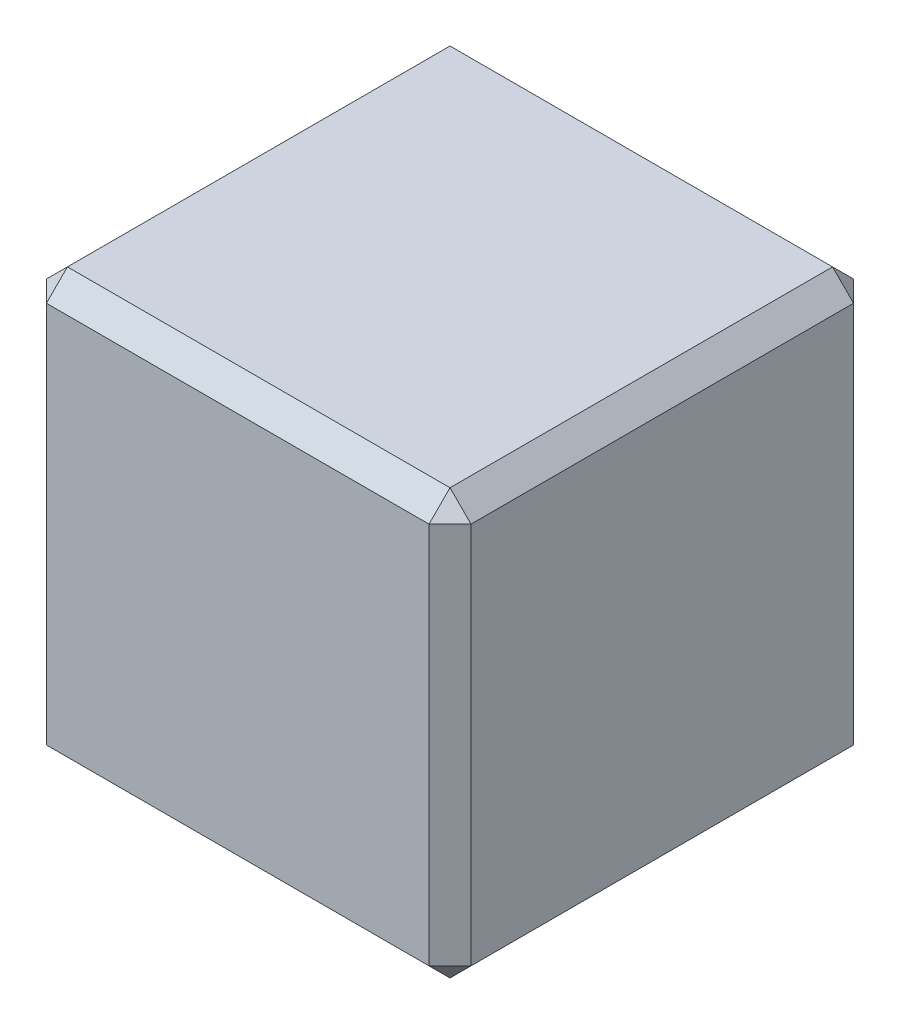
ISO-10303-21;
HEADER;
FILE_DESCRIPTION(('STEP AP214'),'2;1');
FILE_NAME('part.step','',(''),(''),'','','');
FILE_SCHEMA(('AUTOMOTIVE_DESIGN { 1 0 10303 214 1 1 1 1 }'));
ENDSEC;
DATA;
#1=APPLICATION_CONTEXT('core data for automotive mechanical design processes');
#2=APPLICATION_PROTOCOL_DEFINITION('international standard','automotive_design',2000,#1);
#3=PRODUCT_CONTEXT('',#1,'mechanical');
#4=PRODUCT('Part','Part','',(#3));
#5=PRODUCT_RELATED_PRODUCT_CATEGORY('part','',(#4));
#6=PRODUCT_DEFINITION_FORMATION('','',#4);
#7=PRODUCT_DEFINITION_CONTEXT('part definition',#1,'design');
#8=PRODUCT_DEFINITION('design','',#6,#7);
#9=PRODUCT_DEFINITION_SHAPE('','',#8);
#10=(LENGTH_UNIT() NAMED_UNIT(*) SI_UNIT(.MILLI.,.METRE.));
#11=(NAMED_UNIT(*) PLANE_ANGLE_UNIT() SI_UNIT($,.RADIAN.));
#12=(NAMED_UNIT(*) SI_UNIT($,.STERADIAN.) SOLID_ANGLE_UNIT());
#13=UNCERTAINTY_MEASURE_WITH_UNIT(LENGTH_MEASURE(1.E-05),#10,'distance_accuracy_value','');
#14=(GEOMETRIC_REPRESENTATION_CONTEXT(3) GLOBAL_UNCERTAINTY_ASSIGNED_CONTEXT((#13)) GLOBAL_UNIT_ASSIGNED_CONTEXT((#10,
#11,#12)) REPRESENTATION_CONTEXT('',''));
#15=CARTESIAN_POINT('',(0.,0.,0.));
#16=DIRECTION('',(0.,0.,1.));
#17=DIRECTION('',(1.,0.,0.));
#18=AXIS2_PLACEMENT_3D('',#15,#16,#17);
#19=CARTESIAN_POINT('',(50.54,101.08,-50.54));
#20=DIRECTION('',(-1.,0.,0.));
#21=DIRECTION('',(0.,0.,1.));
#22=AXIS2_PLACEMENT_3D('',#19,#20,#21);
#23=PLANE('',#22);
#24=DIRECTION('',(0.,0.,-1.));
#25=VECTOR('',#24,1.);
#26=CARTESIAN_POINT('',(50.54,5.00000000000005,-50.54));
#27=LINE('',#26,#25);
#28=CARTESIAN_POINT('',(50.54,5.00000000000005,45.54));
#29=VERTEX_POINT('',#28);
#30=CARTESIAN_POINT('',(50.54,5.00000000000005,-45.54));
#31=VERTEX_POINT('',#30);
#32=EDGE_CURVE('E286',#29,#31,#27,.T.);
#33=ORIENTED_EDGE('',*,*,#32,.T.);
#34=DIRECTION('',(0.,1.,0.));
#35=VECTOR('',#34,1.);
#36=CARTESIAN_POINT('',(50.54,101.08,-45.54));
#37=LINE('',#36,#35);
#38=CARTESIAN_POINT('',(50.54,96.08,-45.54));
#39=VERTEX_POINT('',#38);
#40=EDGE_CURVE('E218',#31,#39,#37,.T.);
#41=ORIENTED_EDGE('',*,*,#40,.T.);
#42=DIRECTION('',(0.,0.,1.));
#43=VECTOR('',#42,1.);
#44=CARTESIAN_POINT('',(50.54,96.08,50.54));
#45=LINE('',#44,#43);
#46=CARTESIAN_POINT('',(50.54,96.08,45.54));
#47=VERTEX_POINT('',#46);
#48=EDGE_CURVE('E279',#39,#47,#45,.T.);
#49=ORIENTED_EDGE('',*,*,#48,.T.);
#50=DIRECTION('',(0.,-1.,0.));
#51=VECTOR('',#50,1.);
#52=CARTESIAN_POINT('',(50.54,101.08,45.54));
#53=LINE('',#52,#51);
#54=EDGE_CURVE('E281',#47,#29,#53,.T.);
#55=ORIENTED_EDGE('',*,*,#54,.T.);
#56=EDGE_LOOP('',(#33,#41,#49,#55));
#57=FACE_BOUND('',#56,.T.);
#58=ADVANCED_FACE('F39',(#57),#23,.F.);
#59=CARTESIAN_POINT('',(-50.54,101.08,-50.54));
#60=DIRECTION('',(0.,0.,1.));
#61=DIRECTION('',(1.,0.,0.));
#62=AXIS2_PLACEMENT_3D('',#59,#60,#61);
#63=PLANE('',#62);
#64=DIRECTION('',(0.,-1.,0.));
#65=VECTOR('',#64,1.);
#66=CARTESIAN_POINT('',(45.54,101.08,-50.54));
#67=LINE('',#66,#65);
#68=CARTESIAN_POINT('',(45.54,96.08,-50.54));
#69=VERTEX_POINT('',#68);
#70=CARTESIAN_POINT('',(45.54,5.00000000000002,-50.54));
#71=VERTEX_POINT('',#70);
#72=EDGE_CURVE('E137',#69,#71,#67,.T.);
#73=ORIENTED_EDGE('',*,*,#72,.T.);
#74=DIRECTION('',(-1.,0.,0.));
#75=VECTOR('',#74,1.);
#76=CARTESIAN_POINT('',(-50.54,5.00000000000002,-50.54));
#77=LINE('',#76,#75);
#78=CARTESIAN_POINT('',(-45.54,5.00000000000002,-50.54));
#79=VERTEX_POINT('',#78);
#80=EDGE_CURVE('E133',#71,#79,#77,.T.);
#81=ORIENTED_EDGE('',*,*,#80,.T.);
#82=DIRECTION('',(0.,1.,0.));
#83=VECTOR('',#82,1.);
#84=CARTESIAN_POINT('',(-45.54,101.08,-50.54));
#85=LINE('',#84,#83);
#86=CARTESIAN_POINT('',(-45.54,96.08,-50.54));
#87=VERTEX_POINT('',#86);
#88=EDGE_CURVE('E127',#79,#87,#85,.T.);
#89=ORIENTED_EDGE('',*,*,#88,.T.);
#90=DIRECTION('',(1.,0.,0.));
#91=VECTOR('',#90,1.);
#92=CARTESIAN_POINT('',(50.54,96.08,-50.54));
#93=LINE('',#92,#91);
#94=EDGE_CURVE('E130',#87,#69,#93,.T.);
#95=ORIENTED_EDGE('',*,*,#94,.T.);
#96=EDGE_LOOP('',(#73,#81,#89,#95));
#97=FACE_BOUND('',#96,.T.);
#98=ADVANCED_FACE('F129',(#97),#63,.F.);
#99=CARTESIAN_POINT('',(-50.54,101.08,-50.54));
#100=DIRECTION('',(1.,0.,0.));
#101=DIRECTION('',(0.,0.,-1.));
#102=AXIS2_PLACEMENT_3D('',#99,#100,#101);
#103=PLANE('',#102);
#104=DIRECTION('',(0.,0.,-1.));
#105=VECTOR('',#104,1.);
#106=CARTESIAN_POINT('',(-50.54,96.08,-50.54));
#107=LINE('',#106,#105);
#108=CARTESIAN_POINT('',(-50.54,96.08,45.54));
#109=VERTEX_POINT('',#108);
#110=CARTESIAN_POINT('',(-50.54,96.08,-45.54));
#111=VERTEX_POINT('',#110);
#112=EDGE_CURVE('E228',#109,#111,#107,.T.);
#113=ORIENTED_EDGE('',*,*,#112,.T.);
#114=DIRECTION('',(0.,-1.,0.));
#115=VECTOR('',#114,1.);
#116=CARTESIAN_POINT('',(-50.54,101.08,-45.54));
#117=LINE('',#116,#115);
#118=CARTESIAN_POINT('',(-50.54,5.00000000000002,-45.54));
#119=VERTEX_POINT('',#118);
#120=EDGE_CURVE('E159',#111,#119,#117,.T.);
#121=ORIENTED_EDGE('',*,*,#120,.T.);
#122=DIRECTION('',(0.,0.,1.));
#123=VECTOR('',#122,1.);
#124=CARTESIAN_POINT('',(-50.54,5.00000000000002,-50.54));
#125=LINE('',#124,#123);
#126=CARTESIAN_POINT('',(-50.54,5.00000000000002,45.54));
#127=VERTEX_POINT('',#126);
#128=EDGE_CURVE('E236',#119,#127,#125,.T.);
#129=ORIENTED_EDGE('',*,*,#128,.T.);
#130=DIRECTION('',(0.,1.,0.));
#131=VECTOR('',#130,1.);
#132=CARTESIAN_POINT('',(-50.54,101.08,45.54));
#133=LINE('',#132,#131);
#134=EDGE_CURVE('E230',#127,#109,#133,.T.);
#135=ORIENTED_EDGE('',*,*,#134,.T.);
#136=EDGE_LOOP('',(#113,#121,#129,#135));
#137=FACE_BOUND('',#136,.T.);
#138=ADVANCED_FACE('F330',(#137),#103,.F.);
#139=CARTESIAN_POINT('',(-50.54,101.08,50.54));
#140=DIRECTION('',(0.,0.,-1.));
#141=DIRECTION('',(-1.,0.,0.));
#142=AXIS2_PLACEMENT_3D('',#139,#140,#141);
#143=PLANE('',#142);
#144=DIRECTION('',(1.,0.,0.));
#145=VECTOR('',#144,1.);
#146=CARTESIAN_POINT('',(-50.54,5.00000000000002,50.54));
#147=LINE('',#146,#145);
#148=CARTESIAN_POINT('',(-45.54,5.00000000000002,50.54));
#149=VERTEX_POINT('',#148);
#150=CARTESIAN_POINT('',(45.54,5.00000000000002,50.54));
#151=VERTEX_POINT('',#150);
#152=EDGE_CURVE('E224',#149,#151,#147,.T.);
#153=ORIENTED_EDGE('',*,*,#152,.T.);
#154=DIRECTION('',(0.,1.,0.));
#155=VECTOR('',#154,1.);
#156=CARTESIAN_POINT('',(45.54,101.08,50.54));
#157=LINE('',#156,#155);
#158=CARTESIAN_POINT('',(45.54,96.08,50.54));
#159=VERTEX_POINT('',#158);
#160=EDGE_CURVE('E221',#151,#159,#157,.T.);
#161=ORIENTED_EDGE('',*,*,#160,.T.);
#162=DIRECTION('',(-1.,0.,0.));
#163=VECTOR('',#162,1.);
#164=CARTESIAN_POINT('',(-50.54,96.08,50.54));
#165=LINE('',#164,#163);
#166=CARTESIAN_POINT('',(-45.54,96.08,50.54));
#167=VERTEX_POINT('',#166);
#168=EDGE_CURVE('E214',#159,#167,#165,.T.);
#169=ORIENTED_EDGE('',*,*,#168,.T.);
#170=DIRECTION('',(0.,-1.,0.));
#171=VECTOR('',#170,1.);
#172=CARTESIAN_POINT('',(-45.54,101.08,50.54));
#173=LINE('',#172,#171);
#174=EDGE_CURVE('E217',#167,#149,#173,.T.);
#175=ORIENTED_EDGE('',*,*,#174,.T.);
#176=EDGE_LOOP('',(#153,#161,#169,#175));
#177=FACE_BOUND('',#176,.T.);
#178=ADVANCED_FACE('F222',(#177),#143,.F.);
#179=CARTESIAN_POINT('',(0.,101.08,0.));
#180=DIRECTION('',(0.,1.,0.));
#181=DIRECTION('',(0.,0.,1.));
#182=AXIS2_PLACEMENT_3D('',#179,#180,#181);
#183=PLANE('',#182);
#184=DIRECTION('',(0.,0.,1.));
#185=VECTOR('',#184,1.);
#186=CARTESIAN_POINT('',(-45.54,101.08,50.54));
#187=LINE('',#186,#185);
#188=CARTESIAN_POINT('',(-45.54,101.08,-45.54));
#189=VERTEX_POINT('',#188);
#190=CARTESIAN_POINT('',(-45.54,101.08,45.54));
#191=VERTEX_POINT('',#190);
#192=EDGE_CURVE('E48',#189,#191,#187,.T.);
#193=ORIENTED_EDGE('',*,*,#192,.T.);
#194=DIRECTION('',(1.,0.,0.));
#195=VECTOR('',#194,1.);
#196=CARTESIAN_POINT('',(50.54,101.08,45.54));
#197=LINE('',#196,#195);
#198=CARTESIAN_POINT('',(45.54,101.08,45.54));
#199=VERTEX_POINT('',#198);
#200=EDGE_CURVE('E11',#191,#199,#197,.T.);
#201=ORIENTED_EDGE('',*,*,#200,.T.);
#202=DIRECTION('',(0.,0.,-1.));
#203=VECTOR('',#202,1.);
#204=CARTESIAN_POINT('',(45.54,101.08,-50.54));
#205=LINE('',#204,#203);
#206=CARTESIAN_POINT('',(45.54,101.08,-45.54));
#207=VERTEX_POINT('',#206);
#208=EDGE_CURVE('E239',#199,#207,#205,.T.);
#209=ORIENTED_EDGE('',*,*,#208,.T.);
#210=DIRECTION('',(-1.,0.,0.));
#211=VECTOR('',#210,1.);
#212=CARTESIAN_POINT('',(-50.54,101.08,-45.54));
#213=LINE('',#212,#211);
#214=EDGE_CURVE('E59',#207,#189,#213,.T.);
#215=ORIENTED_EDGE('',*,*,#214,.T.);
#216=EDGE_LOOP('',(#193,#201,#209,#215));
#217=FACE_BOUND('',#216,.T.);
#218=ADVANCED_FACE('F488',(#217),#183,.T.);
#219=CARTESIAN_POINT('',(0.,0.,0.));
#220=DIRECTION('',(0.,1.,0.));
#221=DIRECTION('',(0.,0.,1.));
#222=AXIS2_PLACEMENT_3D('',#219,#220,#221);
#223=PLANE('',#222);
#224=DIRECTION('',(0.,0.,-1.));
#225=VECTOR('',#224,1.);
#226=CARTESIAN_POINT('',(-45.54,0.,0.));
#227=LINE('',#226,#225);
#228=CARTESIAN_POINT('',(-45.54,0.,45.54));
#229=VERTEX_POINT('',#228);
#230=CARTESIAN_POINT('',(-45.54,0.,-45.54));
#231=VERTEX_POINT('',#230);
#232=EDGE_CURVE('E275',#229,#231,#227,.T.);
#233=ORIENTED_EDGE('',*,*,#232,.T.);
#234=DIRECTION('',(1.,0.,0.));
#235=VECTOR('',#234,1.);
#236=CARTESIAN_POINT('',(0.,0.,-45.54));
#237=LINE('',#236,#235);
#238=CARTESIAN_POINT('',(45.54,0.,-45.54));
#239=VERTEX_POINT('',#238);
#240=EDGE_CURVE('E269',#231,#239,#237,.T.);
#241=ORIENTED_EDGE('',*,*,#240,.T.);
#242=DIRECTION('',(0.,0.,1.));
#243=VECTOR('',#242,1.);
#244=CARTESIAN_POINT('',(45.54,0.,0.));
#245=LINE('',#244,#243);
#246=CARTESIAN_POINT('',(45.54,0.,45.54));
#247=VERTEX_POINT('',#246);
#248=EDGE_CURVE('E263',#239,#247,#245,.T.);
#249=ORIENTED_EDGE('',*,*,#248,.T.);
#250=DIRECTION('',(-1.,0.,0.));
#251=VECTOR('',#250,1.);
#252=CARTESIAN_POINT('',(0.,0.,45.54));
#253=LINE('',#252,#251);
#254=EDGE_CURVE('E270',#247,#229,#253,.T.);
#255=ORIENTED_EDGE('',*,*,#254,.T.);
#256=EDGE_LOOP('',(#233,#241,#249,#255));
#257=FACE_BOUND('',#256,.T.);
#258=ADVANCED_FACE('F273',(#257),#223,.F.);
#259=CARTESIAN_POINT('',(0.,101.08,45.54));
#260=DIRECTION('',(0.,0.707106781186545,0.707106781186549));
#261=DIRECTION('',(-1.,0.,0.));
#262=AXIS2_PLACEMENT_3D('',#259,#260,#261);
#263=PLANE('',#262);
#264=DIRECTION('',(0.,-0.70710678118655,0.707106781186545));
#265=VECTOR('',#264,1.);
#266=CARTESIAN_POINT('',(45.54,96.08,50.54));
#267=LINE('',#266,#265);
#268=EDGE_CURVE('E43',#199,#159,#267,.T.);
#269=ORIENTED_EDGE('',*,*,#268,.F.);
#270=ORIENTED_EDGE('',*,*,#200,.F.);
#271=DIRECTION('',(0.,0.70710678118655,-0.707106781186545));
#272=VECTOR('',#271,1.);
#273=CARTESIAN_POINT('',(-45.54,98.58,48.04));
#274=LINE('',#273,#272);
#275=EDGE_CURVE('E199',#167,#191,#274,.T.);
#276=ORIENTED_EDGE('',*,*,#275,.F.);
#277=ORIENTED_EDGE('',*,*,#168,.F.);
#278=EDGE_LOOP('',(#269,#270,#276,#277));
#279=FACE_BOUND('',#278,.T.);
#280=ADVANCED_FACE('F41',(#279),#263,.T.);
#281=CARTESIAN_POINT('',(45.54,96.08,50.54));
#282=DIRECTION('',(0.577350269189629,0.577350269189623,0.577350269189626));
#283=DIRECTION('',(0.707106781186546,0.,-0.70710678118655));
#284=AXIS2_PLACEMENT_3D('',#281,#282,#283);
#285=PLANE('',#284);
#286=DIRECTION('',(-0.707106781186546,0.707106781186549,0.));
#287=VECTOR('',#286,1.);
#288=CARTESIAN_POINT('',(48.04,98.58,45.54));
#289=LINE('',#288,#287);
#290=EDGE_CURVE('E195',#199,#47,#289,.F.);
#291=ORIENTED_EDGE('',*,*,#290,.F.);
#292=ORIENTED_EDGE('',*,*,#268,.T.);
#293=DIRECTION('',(-0.707106781186545,0.,0.70710678118655));
#294=VECTOR('',#293,1.);
#295=CARTESIAN_POINT('',(45.54,96.08,50.54));
#296=LINE('',#295,#294);
#297=EDGE_CURVE('E198',#47,#159,#296,.T.);
#298=ORIENTED_EDGE('',*,*,#297,.F.);
#299=EDGE_LOOP('',(#291,#292,#298));
#300=FACE_BOUND('',#299,.T.);
#301=ADVANCED_FACE('F211',(#300),#285,.T.);
#302=CARTESIAN_POINT('',(-50.54,96.08,45.54));
#303=DIRECTION('',(-0.577350269189629,0.577350269189623,0.577350269189626));
#304=DIRECTION('',(0.707106781186546,0.,0.70710678118655));
#305=AXIS2_PLACEMENT_3D('',#302,#303,#304);
#306=PLANE('',#305);
#307=DIRECTION('',(-0.707106781186545,0.,-0.70710678118655));
#308=VECTOR('',#307,1.);
#309=CARTESIAN_POINT('',(-50.54,96.08,45.54));
#310=LINE('',#309,#308);
#311=EDGE_CURVE('E189',#167,#109,#310,.T.);
#312=ORIENTED_EDGE('',*,*,#311,.F.);
#313=ORIENTED_EDGE('',*,*,#275,.T.);
#314=DIRECTION('',(-0.707106781186545,-0.707106781186549,0.));
#315=VECTOR('',#314,1.);
#316=CARTESIAN_POINT('',(-50.54,96.08,45.54));
#317=LINE('',#316,#315);
#318=EDGE_CURVE('E192',#109,#191,#317,.F.);
#319=ORIENTED_EDGE('',*,*,#318,.F.);
#320=EDGE_LOOP('',(#312,#313,#319));
#321=FACE_BOUND('',#320,.T.);
#322=ADVANCED_FACE('F461',(#321),#306,.T.);
#323=CARTESIAN_POINT('',(50.54,101.08,45.54));
#324=DIRECTION('',(-0.707106781186549,0.,-0.707106781186545));
#325=DIRECTION('',(0.,-1.,0.));
#326=AXIS2_PLACEMENT_3D('',#323,#324,#325);
#327=PLANE('',#326);
#328=ORIENTED_EDGE('',*,*,#297,.T.);
#329=ORIENTED_EDGE('',*,*,#160,.F.);
#330=DIRECTION('',(0.707106781186546,0.,-0.707106781186549));
#331=VECTOR('',#330,1.);
#332=CARTESIAN_POINT('',(48.04,5.00000000000003,48.04));
#333=LINE('',#332,#331);
#334=EDGE_CURVE('E183',#29,#151,#333,.F.);
#335=ORIENTED_EDGE('',*,*,#334,.F.);
#336=ORIENTED_EDGE('',*,*,#54,.F.);
#337=EDGE_LOOP('',(#328,#329,#335,#336));
#338=FACE_BOUND('',#337,.T.);
#339=ADVANCED_FACE('F312',(#338),#327,.F.);
#340=CARTESIAN_POINT('',(45.54,101.08,0.));
#341=DIRECTION('',(0.707106781186549,0.707106781186545,0.));
#342=DIRECTION('',(0.,0.,1.));
#343=AXIS2_PLACEMENT_3D('',#340,#341,#342);
#344=PLANE('',#343);
#345=ORIENTED_EDGE('',*,*,#290,.T.);
#346=ORIENTED_EDGE('',*,*,#48,.F.);
#347=DIRECTION('',(0.707106781186546,-0.707106781186549,0.));
#348=VECTOR('',#347,1.);
#349=CARTESIAN_POINT('',(50.54,96.08,-45.54));
#350=LINE('',#349,#348);
#351=EDGE_CURVE('E180',#207,#39,#350,.T.);
#352=ORIENTED_EDGE('',*,*,#351,.F.);
#353=ORIENTED_EDGE('',*,*,#208,.F.);
#354=EDGE_LOOP('',(#345,#346,#352,#353));
#355=FACE_BOUND('',#354,.T.);
#356=ADVANCED_FACE('F445',(#355),#344,.T.);
#357=CARTESIAN_POINT('',(0.,101.08,-45.54));
#358=DIRECTION('',(0.,0.707106781186545,-0.707106781186549));
#359=DIRECTION('',(1.,0.,0.));
#360=AXIS2_PLACEMENT_3D('',#357,#358,#359);
#361=PLANE('',#360);
#362=DIRECTION('',(0.,-0.707106781186549,-0.707106781186545));
#363=VECTOR('',#362,1.);
#364=CARTESIAN_POINT('',(-45.54,96.08,-50.54));
#365=LINE('',#364,#363);
#366=EDGE_CURVE('E143',#189,#87,#365,.T.);
#367=ORIENTED_EDGE('',*,*,#366,.F.);
#368=ORIENTED_EDGE('',*,*,#214,.F.);
#369=DIRECTION('',(0.,0.70710678118655,0.707106781186545));
#370=VECTOR('',#369,1.);
#371=CARTESIAN_POINT('',(45.54,98.58,-48.04));
#372=LINE('',#371,#370);
#373=EDGE_CURVE('E146',#69,#207,#372,.T.);
#374=ORIENTED_EDGE('',*,*,#373,.F.);
#375=ORIENTED_EDGE('',*,*,#94,.F.);
#376=EDGE_LOOP('',(#367,#368,#374,#375));
#377=FACE_BOUND('',#376,.T.);
#378=ADVANCED_FACE('F142',(#377),#361,.T.);
#379=CARTESIAN_POINT('',(-45.54,101.08,0.));
#380=DIRECTION('',(-0.707106781186549,0.707106781186545,0.));
#381=DIRECTION('',(0.,0.,-1.));
#382=AXIS2_PLACEMENT_3D('',#379,#380,#381);
#383=PLANE('',#382);
#384=ORIENTED_EDGE('',*,*,#318,.T.);
#385=ORIENTED_EDGE('',*,*,#192,.F.);
#386=DIRECTION('',(0.707106781186545,0.70710678118655,0.));
#387=VECTOR('',#386,1.);
#388=CARTESIAN_POINT('',(-48.04,98.58,-45.54));
#389=LINE('',#388,#387);
#390=EDGE_CURVE('E155',#111,#189,#389,.T.);
#391=ORIENTED_EDGE('',*,*,#390,.F.);
#392=ORIENTED_EDGE('',*,*,#112,.F.);
#393=EDGE_LOOP('',(#384,#385,#391,#392));
#394=FACE_BOUND('',#393,.T.);
#395=ADVANCED_FACE('F429',(#394),#383,.T.);
#396=CARTESIAN_POINT('',(-45.54,101.08,50.54));
#397=DIRECTION('',(0.707106781186549,0.,-0.707106781186545));
#398=DIRECTION('',(0.,-1.,0.));
#399=AXIS2_PLACEMENT_3D('',#396,#397,#398);
#400=PLANE('',#399);
#401=ORIENTED_EDGE('',*,*,#311,.T.);
#402=ORIENTED_EDGE('',*,*,#134,.F.);
#403=DIRECTION('',(0.707106781186546,0.,0.707106781186549));
#404=VECTOR('',#403,1.);
#405=CARTESIAN_POINT('',(-48.04,5.00000000000002,48.04));
#406=LINE('',#405,#404);
#407=EDGE_CURVE('E175',#149,#127,#406,.F.);
#408=ORIENTED_EDGE('',*,*,#407,.F.);
#409=ORIENTED_EDGE('',*,*,#174,.F.);
#410=EDGE_LOOP('',(#401,#402,#408,#409));
#411=FACE_BOUND('',#410,.T.);
#412=ADVANCED_FACE('F297',(#411),#400,.F.);
#413=CARTESIAN_POINT('',(-50.54,5.00000000000002,50.54));
#414=DIRECTION('',(0.,0.707106781186549,-0.707106781186545));
#415=DIRECTION('',(1.,0.,0.));
#416=AXIS2_PLACEMENT_3D('',#413,#414,#415);
#417=PLANE('',#416);
#418=DIRECTION('',(0.,0.707106781186546,0.707106781186549));
#419=VECTOR('',#418,1.);
#420=CARTESIAN_POINT('',(45.54,0.,45.54));
#421=LINE('',#420,#419);
#422=EDGE_CURVE('E186',#151,#247,#421,.F.);
#423=ORIENTED_EDGE('',*,*,#422,.F.);
#424=ORIENTED_EDGE('',*,*,#152,.F.);
#425=DIRECTION('',(0.,-0.707106781186546,-0.707106781186549));
#426=VECTOR('',#425,1.);
#427=CARTESIAN_POINT('',(-45.54,0.,45.54));
#428=LINE('',#427,#426);
#429=EDGE_CURVE('E172',#229,#149,#428,.F.);
#430=ORIENTED_EDGE('',*,*,#429,.F.);
#431=ORIENTED_EDGE('',*,*,#254,.F.);
#432=EDGE_LOOP('',(#423,#424,#430,#431));
#433=FACE_BOUND('',#432,.T.);
#434=ADVANCED_FACE('F294',(#433),#417,.F.);
#435=CARTESIAN_POINT('',(45.54,0.,45.54));
#436=DIRECTION('',(0.577350269189629,-0.577350269189626,0.577350269189623));
#437=DIRECTION('',(0.707106781186545,0.707106781186549,0.));
#438=AXIS2_PLACEMENT_3D('',#435,#436,#437);
#439=PLANE('',#438);
#440=ORIENTED_EDGE('',*,*,#334,.T.);
#441=ORIENTED_EDGE('',*,*,#422,.T.);
#442=DIRECTION('',(-0.707106781186545,-0.707106781186549,0.));
#443=VECTOR('',#442,1.);
#444=CARTESIAN_POINT('',(45.54,0.,45.54));
#445=LINE('',#444,#443);
#446=EDGE_CURVE('E163',#29,#247,#445,.T.);
#447=ORIENTED_EDGE('',*,*,#446,.F.);
#448=EDGE_LOOP('',(#440,#441,#447));
#449=FACE_BOUND('',#448,.T.);
#450=ADVANCED_FACE('F314',(#449),#439,.T.);
#451=CARTESIAN_POINT('',(50.54,96.08,-45.54));
#452=DIRECTION('',(0.577350269189629,0.577350269189623,-0.577350269189626));
#453=DIRECTION('',(-0.707106781186546,0.,-0.70710678118655));
#454=AXIS2_PLACEMENT_3D('',#451,#452,#453);
#455=PLANE('',#454);
#456=ORIENTED_EDGE('',*,*,#373,.T.);
#457=ORIENTED_EDGE('',*,*,#351,.T.);
#458=DIRECTION('',(0.707106781186545,0.,0.70710678118655));
#459=VECTOR('',#458,1.);
#460=CARTESIAN_POINT('',(50.54,96.08,-45.54));
#461=LINE('',#460,#459);
#462=EDGE_CURVE('E160',#69,#39,#461,.T.);
#463=ORIENTED_EDGE('',*,*,#462,.F.);
#464=EDGE_LOOP('',(#456,#457,#463));
#465=FACE_BOUND('',#464,.T.);
#466=ADVANCED_FACE('F316',(#465),#455,.T.);
#467=CARTESIAN_POINT('',(-45.54,96.08,-50.54));
#468=DIRECTION('',(-0.577350269189626,0.577350269189623,-0.577350269189629));
#469=DIRECTION('',(-0.70710678118655,0.,0.707106781186546));
#470=AXIS2_PLACEMENT_3D('',#467,#468,#469);
#471=PLANE('',#470);
#472=ORIENTED_EDGE('',*,*,#390,.T.);
#473=ORIENTED_EDGE('',*,*,#366,.T.);
#474=DIRECTION('',(0.70710678118655,0.,-0.707106781186545));
#475=VECTOR('',#474,1.);
#476=CARTESIAN_POINT('',(-45.54,96.08,-50.54));
#477=LINE('',#476,#475);
#478=EDGE_CURVE('E152',#111,#87,#477,.T.);
#479=ORIENTED_EDGE('',*,*,#478,.F.);
#480=EDGE_LOOP('',(#472,#473,#479));
#481=FACE_BOUND('',#480,.T.);
#482=ADVANCED_FACE('F151',(#481),#471,.T.);
#483=CARTESIAN_POINT('',(-45.54,0.,45.54));
#484=DIRECTION('',(-0.577350269189626,-0.577350269189629,0.577350269189623));
#485=DIRECTION('',(0.707106781186549,-0.707106781186545,0.));
#486=AXIS2_PLACEMENT_3D('',#483,#484,#485);
#487=PLANE('',#486);
#488=ORIENTED_EDGE('',*,*,#429,.T.);
#489=ORIENTED_EDGE('',*,*,#407,.T.);
#490=DIRECTION('',(-0.707106781186549,0.707106781186546,0.));
#491=VECTOR('',#490,1.);
#492=CARTESIAN_POINT('',(-45.54,0.,45.54));
#493=LINE('',#492,#491);
#494=EDGE_CURVE('E161',#229,#127,#493,.T.);
#495=ORIENTED_EDGE('',*,*,#494,.F.);
#496=EDGE_LOOP('',(#488,#489,#495));
#497=FACE_BOUND('',#496,.T.);
#498=ADVANCED_FACE('F299',(#497),#487,.T.);
#499=CARTESIAN_POINT('',(50.54,5.00000000000005,-50.54));
#500=DIRECTION('',(-0.707106781186549,0.707106781186545,0.));
#501=DIRECTION('',(0.,0.,-1.));
#502=AXIS2_PLACEMENT_3D('',#499,#500,#501);
#503=PLANE('',#502);
#504=ORIENTED_EDGE('',*,*,#446,.T.);
#505=ORIENTED_EDGE('',*,*,#248,.F.);
#506=DIRECTION('',(0.707106781186545,0.707106781186549,0.));
#507=VECTOR('',#506,1.);
#508=CARTESIAN_POINT('',(45.54,0.,-45.54));
#509=LINE('',#508,#507);
#510=EDGE_CURVE('E166',#31,#239,#509,.F.);
#511=ORIENTED_EDGE('',*,*,#510,.F.);
#512=ORIENTED_EDGE('',*,*,#32,.F.);
#513=EDGE_LOOP('',(#504,#505,#511,#512));
#514=FACE_BOUND('',#513,.T.);
#515=ADVANCED_FACE('F265',(#514),#503,.F.);
#516=CARTESIAN_POINT('',(45.54,101.08,-50.54));
#517=DIRECTION('',(-0.707106781186549,0.,0.707106781186545));
#518=DIRECTION('',(0.,-1.,0.));
#519=AXIS2_PLACEMENT_3D('',#516,#517,#518);
#520=PLANE('',#519);
#521=ORIENTED_EDGE('',*,*,#462,.T.);
#522=ORIENTED_EDGE('',*,*,#40,.F.);
#523=DIRECTION('',(-0.707106781186546,0.,-0.707106781186549));
#524=VECTOR('',#523,1.);
#525=CARTESIAN_POINT('',(48.04,5.00000000000003,-48.04));
#526=LINE('',#525,#524);
#527=EDGE_CURVE('E252',#71,#31,#526,.F.);
#528=ORIENTED_EDGE('',*,*,#527,.F.);
#529=ORIENTED_EDGE('',*,*,#72,.F.);
#530=EDGE_LOOP('',(#521,#522,#528,#529));
#531=FACE_BOUND('',#530,.T.);
#532=ADVANCED_FACE('F309',(#531),#520,.F.);
#533=CARTESIAN_POINT('',(-50.54,101.08,-45.54));
#534=DIRECTION('',(0.707106781186545,0.,0.707106781186549));
#535=DIRECTION('',(0.,-1.,0.));
#536=AXIS2_PLACEMENT_3D('',#533,#534,#535);
#537=PLANE('',#536);
#538=ORIENTED_EDGE('',*,*,#478,.T.);
#539=ORIENTED_EDGE('',*,*,#88,.F.);
#540=DIRECTION('',(-0.70710678118655,0.,0.707106781186545));
#541=VECTOR('',#540,1.);
#542=CARTESIAN_POINT('',(-45.54,5.00000000000002,-50.54));
#543=LINE('',#542,#541);
#544=EDGE_CURVE('E249',#119,#79,#543,.F.);
#545=ORIENTED_EDGE('',*,*,#544,.F.);
#546=ORIENTED_EDGE('',*,*,#120,.F.);
#547=EDGE_LOOP('',(#538,#539,#545,#546));
#548=FACE_BOUND('',#547,.T.);
#549=ADVANCED_FACE('F157',(#548),#537,.F.);
#550=CARTESIAN_POINT('',(-50.54,5.00000000000002,-50.54));
#551=DIRECTION('',(0.707106781186545,0.707106781186549,0.));
#552=DIRECTION('',(0.,0.,1.));
#553=AXIS2_PLACEMENT_3D('',#550,#551,#552);
#554=PLANE('',#553);
#555=ORIENTED_EDGE('',*,*,#494,.T.);
#556=ORIENTED_EDGE('',*,*,#128,.F.);
#557=DIRECTION('',(0.707106781186549,-0.707106781186545,0.));
#558=VECTOR('',#557,1.);
#559=CARTESIAN_POINT('',(-48.04,2.50000000000001,-45.54));
#560=LINE('',#559,#558);
#561=EDGE_CURVE('E247',#231,#119,#560,.F.);
#562=ORIENTED_EDGE('',*,*,#561,.F.);
#563=ORIENTED_EDGE('',*,*,#232,.F.);
#564=EDGE_LOOP('',(#555,#556,#562,#563));
#565=FACE_BOUND('',#564,.T.);
#566=ADVANCED_FACE('F302',(#565),#554,.F.);
#567=CARTESIAN_POINT('',(45.54,0.,-45.54));
#568=DIRECTION('',(0.577350269189629,-0.577350269189626,-0.577350269189623));
#569=DIRECTION('',(0.707106781186545,0.707106781186549,0.));
#570=AXIS2_PLACEMENT_3D('',#567,#568,#569);
#571=PLANE('',#570);
#572=ORIENTED_EDGE('',*,*,#527,.T.);
#573=ORIENTED_EDGE('',*,*,#510,.T.);
#574=DIRECTION('',(0.,-0.707106781186546,0.707106781186549));
#575=VECTOR('',#574,1.);
#576=CARTESIAN_POINT('',(45.54,0.,-45.54));
#577=LINE('',#576,#575);
#578=EDGE_CURVE('E245',#71,#239,#577,.T.);
#579=ORIENTED_EDGE('',*,*,#578,.F.);
#580=EDGE_LOOP('',(#572,#573,#579));
#581=FACE_BOUND('',#580,.T.);
#582=ADVANCED_FACE('F259',(#581),#571,.T.);
#583=CARTESIAN_POINT('',(-45.54,5.00000000000002,-50.54));
#584=DIRECTION('',(-0.577350269189623,-0.577350269189629,-0.577350269189626));
#585=DIRECTION('',(0.,0.707106781186546,-0.70710678118655));
#586=AXIS2_PLACEMENT_3D('',#583,#584,#585);
#587=PLANE('',#586);
#588=ORIENTED_EDGE('',*,*,#561,.T.);
#589=ORIENTED_EDGE('',*,*,#544,.T.);
#590=DIRECTION('',(0.,0.707106781186545,-0.70710678118655));
#591=VECTOR('',#590,1.);
#592=CARTESIAN_POINT('',(-45.54,5.00000000000002,-50.54));
#593=LINE('',#592,#591);
#594=EDGE_CURVE('E243',#231,#79,#593,.T.);
#595=ORIENTED_EDGE('',*,*,#594,.F.);
#596=EDGE_LOOP('',(#588,#589,#595));
#597=FACE_BOUND('',#596,.T.);
#598=ADVANCED_FACE('F337',(#597),#587,.T.);
#599=CARTESIAN_POINT('',(-50.54,5.00000000000002,-50.54));
#600=DIRECTION('',(0.,0.707106781186549,0.707106781186545));
#601=DIRECTION('',(-1.,0.,0.));
#602=AXIS2_PLACEMENT_3D('',#599,#600,#601);
#603=PLANE('',#602);
#604=ORIENTED_EDGE('',*,*,#578,.T.);
#605=ORIENTED_EDGE('',*,*,#240,.F.);
#606=ORIENTED_EDGE('',*,*,#594,.T.);
#607=ORIENTED_EDGE('',*,*,#80,.F.);
#608=EDGE_LOOP('',(#604,#605,#606,#607));
#609=FACE_BOUND('',#608,.T.);
#610=ADVANCED_FACE('F334',(#609),#603,.F.);
#611=CLOSED_SHELL('',(#58,#98,#138,#178,#218,#258,#280,#301,#322,#339,#356,#378,#395,#412,#434,
#450,#466,#482,#498,#515,#532,#549,#566,#582,#598,#610));
#612=MANIFOLD_SOLID_BREP('B2',#611);
#613=ADVANCED_BREP_SHAPE_REPRESENTATION('',(#18,#612),#14);
#614=SHAPE_DEFINITION_REPRESENTATION(#9,#613);
ENDSEC;
END-ISO-10303-21;
